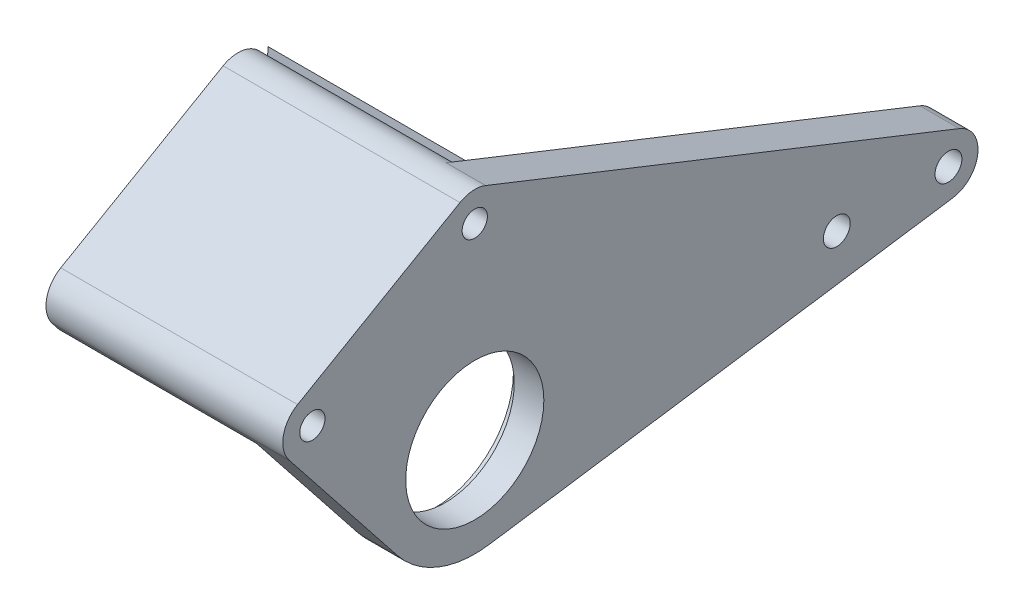
ISO-10303-21;
HEADER;
FILE_DESCRIPTION(('STEP AP214'),'2;1');
FILE_NAME('part.step','',(''),(''),'','','');
FILE_SCHEMA(('AUTOMOTIVE_DESIGN { 1 0 10303 214 1 1 1 1 }'));
ENDSEC;
DATA;
#1=APPLICATION_CONTEXT('core data for automotive mechanical design processes');
#2=APPLICATION_PROTOCOL_DEFINITION('international standard','automotive_design',2000,#1);
#3=PRODUCT_CONTEXT('',#1,'mechanical');
#4=PRODUCT('Part','Part','',(#3));
#5=PRODUCT_RELATED_PRODUCT_CATEGORY('part','',(#4));
#6=PRODUCT_DEFINITION_FORMATION('','',#4);
#7=PRODUCT_DEFINITION_CONTEXT('part definition',#1,'design');
#8=PRODUCT_DEFINITION('design','',#6,#7);
#9=PRODUCT_DEFINITION_SHAPE('','',#8);
#10=(LENGTH_UNIT() NAMED_UNIT(*) SI_UNIT(.MILLI.,.METRE.));
#11=(NAMED_UNIT(*) PLANE_ANGLE_UNIT() SI_UNIT($,.RADIAN.));
#12=(NAMED_UNIT(*) SI_UNIT($,.STERADIAN.) SOLID_ANGLE_UNIT());
#13=UNCERTAINTY_MEASURE_WITH_UNIT(LENGTH_MEASURE(1.E-05),#10,'distance_accuracy_value','');
#14=(GEOMETRIC_REPRESENTATION_CONTEXT(3) GLOBAL_UNCERTAINTY_ASSIGNED_CONTEXT((#13)) GLOBAL_UNIT_ASSIGNED_CONTEXT((#10,
#11,#12)) REPRESENTATION_CONTEXT('',''));
#15=CARTESIAN_POINT('',(0.,0.,0.));
#16=DIRECTION('',(0.,0.,1.));
#17=DIRECTION('',(1.,0.,0.));
#18=AXIS2_PLACEMENT_3D('',#15,#16,#17);
#19=CARTESIAN_POINT('',(6.35,0.,0.));
#20=DIRECTION('',(-1.,0.,0.));
#21=DIRECTION('',(0.,0.,-1.));
#22=AXIS2_PLACEMENT_3D('',#19,#20,#21);
#23=PLANE('',#22);
#24=CARTESIAN_POINT('',(6.35,30.1625,76.2));
#25=DIRECTION('',(1.,0.,0.));
#26=DIRECTION('',(0.,0.,-1.));
#27=AXIS2_PLACEMENT_3D('',#24,#25,#26);
#28=CIRCLE('',#27,2.03200000000001);
#29=CARTESIAN_POINT('',(6.35,30.1625,74.168));
#30=VERTEX_POINT('',#29);
#31=EDGE_CURVE('E387',#30,#30,#28,.T.);
#32=ORIENTED_EDGE('',*,*,#31,.T.);
#33=EDGE_LOOP('',(#32));
#34=FACE_BOUND('',#33,.T.);
#35=DIRECTION('',(0.,1.,0.));
#36=VECTOR('',#35,1.);
#37=CARTESIAN_POINT('',(6.35,28.2927511532294,72.9615));
#38=LINE('',#37,#36);
#39=CARTESIAN_POINT('',(6.35,28.2927511532294,72.9615));
#40=VERTEX_POINT('',#39);
#41=CARTESIAN_POINT('',(6.35,32.0322488467706,72.9615));
#42=VERTEX_POINT('',#41);
#43=EDGE_CURVE('E288',#40,#42,#38,.T.);
#44=ORIENTED_EDGE('',*,*,#43,.F.);
#45=DIRECTION('',(0.,0.5,-0.866025403784438));
#46=VECTOR('',#45,1.);
#47=CARTESIAN_POINT('',(6.35,26.4230023064588,76.2));
#48=LINE('',#47,#46);
#49=CARTESIAN_POINT('',(6.35,26.4230023064588,76.2));
#50=VERTEX_POINT('',#49);
#51=EDGE_CURVE('E312',#50,#40,#48,.T.);
#52=ORIENTED_EDGE('',*,*,#51,.F.);
#53=DIRECTION('',(0.,-0.5,-0.866025403784439));
#54=VECTOR('',#53,1.);
#55=CARTESIAN_POINT('',(6.35,28.2927511532294,79.4385));
#56=LINE('',#55,#54);
#57=CARTESIAN_POINT('',(6.35,28.2927511532294,79.4385));
#58=VERTEX_POINT('',#57);
#59=EDGE_CURVE('E309',#58,#50,#56,.T.);
#60=ORIENTED_EDGE('',*,*,#59,.F.);
#61=DIRECTION('',(0.,-1.,0.));
#62=VECTOR('',#61,1.);
#63=CARTESIAN_POINT('',(6.35,32.0322488467706,79.4385));
#64=LINE('',#63,#62);
#65=CARTESIAN_POINT('',(6.35,32.0322488467706,79.4385));
#66=VERTEX_POINT('',#65);
#67=EDGE_CURVE('E310',#66,#58,#64,.T.);
#68=ORIENTED_EDGE('',*,*,#67,.F.);
#69=DIRECTION('',(0.,-0.5,0.866025403784438));
#70=VECTOR('',#69,1.);
#71=CARTESIAN_POINT('',(6.35,33.9019976935412,76.2));
#72=LINE('',#71,#70);
#73=CARTESIAN_POINT('',(6.35,33.9019976935412,76.2));
#74=VERTEX_POINT('',#73);
#75=EDGE_CURVE('E302',#74,#66,#72,.T.);
#76=ORIENTED_EDGE('',*,*,#75,.F.);
#77=DIRECTION('',(0.,0.500000000000001,0.866025403784438));
#78=VECTOR('',#77,1.);
#79=CARTESIAN_POINT('',(6.35,32.0322488467706,72.9615));
#80=LINE('',#79,#78);
#81=EDGE_CURVE('E234',#42,#74,#80,.T.);
#82=ORIENTED_EDGE('',*,*,#81,.F.);
#83=EDGE_LOOP('',(#44,#52,#60,#68,#76,#82));
#84=FACE_BOUND('',#83,.T.);
#85=ADVANCED_FACE('F44',(#34,#84),#23,.T.);
#86=CARTESIAN_POINT('',(6.35,0.,76.2));
#87=DIRECTION('',(-1.,0.,0.));
#88=DIRECTION('',(0.,0.,1.));
#89=AXIS2_PLACEMENT_3D('',#86,#87,#88);
#90=CIRCLE('',#89,26.19375);
#91=CARTESIAN_POINT('',(6.35,11.4810411416951,99.7435391002543));
#92=VERTEX_POINT('',#91);
#93=CARTESIAN_POINT('',(6.35,26.1523276787176,74.7274864864865));
#94=VERTEX_POINT('',#93);
#95=EDGE_CURVE('E334',#92,#94,#90,.T.);
#96=ORIENTED_EDGE('',*,*,#95,.T.);
#97=CARTESIAN_POINT('',(6.35,29.3223067912894,74.549));
#98=DIRECTION('',(1.,0.,0.));
#99=DIRECTION('',(0.,0.,-1.));
#100=AXIS2_PLACEMENT_3D('',#97,#98,#99);
#101=CIRCLE('',#100,3.175);
#102=CARTESIAN_POINT('',(6.35,29.3223067912894,71.374));
#103=VERTEX_POINT('',#102);
#104=EDGE_CURVE('E52',#103,#94,#101,.F.);
#105=ORIENTED_EDGE('',*,*,#104,.F.);
#106=DIRECTION('',(0.,1.,0.));
#107=VECTOR('',#106,1.);
#108=CARTESIAN_POINT('',(6.35,25.7453347824902,71.374));
#109=LINE('',#108,#107);
#110=CARTESIAN_POINT('',(6.35,33.3742411658046,71.374));
#111=VERTEX_POINT('',#110);
#112=EDGE_CURVE('E329',#103,#111,#109,.T.);
#113=ORIENTED_EDGE('',*,*,#112,.T.);
#114=DIRECTION('',(0.,0.368048451007378,0.929806613071272));
#115=VECTOR('',#114,1.);
#116=CARTESIAN_POINT('',(6.35,4.42820399475193,-1.75283074792264));
#117=LINE('',#116,#115);
#118=CARTESIAN_POINT('',(6.35,4.42820399475193,-1.75283074792264));
#119=VERTEX_POINT('',#118);
#120=EDGE_CURVE('E406',#119,#111,#117,.T.);
#121=ORIENTED_EDGE('',*,*,#120,.F.);
#122=CARTESIAN_POINT('',(6.35,0.,0.));
#123=DIRECTION('',(1.,0.,0.));
#124=DIRECTION('',(0.,0.,-1.));
#125=AXIS2_PLACEMENT_3D('',#122,#123,#124);
#126=CIRCLE('',#125,4.7625);
#127=CARTESIAN_POINT('',(6.35,-4.71158493426293,-0.69453125));
#128=VERTEX_POINT('',#127);
#129=EDGE_CURVE('E401',#128,#119,#126,.T.);
#130=ORIENTED_EDGE('',*,*,#129,.F.);
#131=DIRECTION('',(0.,0.145833333333333,-0.989309172548647));
#132=VECTOR('',#131,1.);
#133=CARTESIAN_POINT('',(6.35,-15.7052831142098,73.8848958333333));
#134=LINE('',#133,#132);
#135=CARTESIAN_POINT('',(6.35,-15.7052831142098,73.8848958333333));
#136=VERTEX_POINT('',#135);
#137=EDGE_CURVE('E416',#136,#128,#134,.T.);
#138=ORIENTED_EDGE('',*,*,#137,.F.);
#139=CARTESIAN_POINT('',(6.35,0.,76.2));
#140=DIRECTION('',(1.,0.,0.));
#141=DIRECTION('',(0.,0.,-1.));
#142=AXIS2_PLACEMENT_3D('',#139,#140,#141);
#143=CIRCLE('',#142,15.875);
#144=CARTESIAN_POINT('',(6.35,-9.85675285972923,88.6442777236053));
#145=VERTEX_POINT('',#144);
#146=EDGE_CURVE('E412',#145,#136,#143,.T.);
#147=ORIENTED_EDGE('',*,*,#146,.F.);
#148=DIRECTION('',(0.,-0.783891510148367,-0.6208978179357));
#149=VECTOR('',#148,1.);
#150=CARTESIAN_POINT('',(6.35,12.1242241420813,106.05477455873));
#151=LINE('',#150,#149);
#152=CARTESIAN_POINT('',(6.35,10.9013319202577,105.086156960158));
#153=VERTEX_POINT('',#152);
#154=EDGE_CURVE('E411',#153,#145,#151,.T.);
#155=ORIENTED_EDGE('',*,*,#154,.F.);
#156=CARTESIAN_POINT('',(6.35,12.8726824922036,102.597301415437));
#157=DIRECTION('',(1.,0.,0.));
#158=DIRECTION('',(0.,0.,-1.));
#159=AXIS2_PLACEMENT_3D('',#156,#157,#158);
#160=CIRCLE('',#159,3.175);
#161=EDGE_CURVE('E11',#92,#153,#160,.F.);
#162=ORIENTED_EDGE('',*,*,#161,.F.);
#163=EDGE_LOOP('',(#96,#105,#113,#121,#130,#138,#147,#155,#162));
#164=FACE_BOUND('',#163,.T.);
#165=CARTESIAN_POINT('',(6.35,0.,76.2));
#166=DIRECTION('',(1.,0.,0.));
#167=DIRECTION('',(0.,0.,-1.));
#168=AXIS2_PLACEMENT_3D('',#165,#166,#167);
#169=CIRCLE('',#168,12.573);
#170=CARTESIAN_POINT('',(6.35,0.,63.627));
#171=VERTEX_POINT('',#170);
#172=EDGE_CURVE('E364',#171,#171,#169,.T.);
#173=ORIENTED_EDGE('',*,*,#172,.T.);
#174=EDGE_LOOP('',(#173));
#175=FACE_BOUND('',#174,.T.);
#176=CARTESIAN_POINT('',(6.35,0.,0.));
#177=DIRECTION('',(1.,0.,0.));
#178=DIRECTION('',(0.,0.,-1.));
#179=AXIS2_PLACEMENT_3D('',#176,#177,#178);
#180=CIRCLE('',#179,2.159);
#181=CARTESIAN_POINT('',(6.35,0.,-2.159));
#182=VERTEX_POINT('',#181);
#183=EDGE_CURVE('E392',#182,#182,#180,.T.);
#184=ORIENTED_EDGE('',*,*,#183,.T.);
#185=EDGE_LOOP('',(#184));
#186=FACE_BOUND('',#185,.T.);
#187=CARTESIAN_POINT('',(6.35,0.,17.9605122421383));
#188=DIRECTION('',(1.,0.,0.));
#189=DIRECTION('',(0.,0.,-1.));
#190=AXIS2_PLACEMENT_3D('',#187,#188,#189);
#191=CIRCLE('',#190,2.159);
#192=CARTESIAN_POINT('',(6.35,0.,15.8015122421383));
#193=VERTEX_POINT('',#192);
#194=EDGE_CURVE('E371',#193,#193,#191,.T.);
#195=ORIENTED_EDGE('',*,*,#194,.T.);
#196=EDGE_LOOP('',(#195));
#197=FACE_BOUND('',#196,.T.);
#198=ADVANCED_FACE('F488',(#164,#175,#186,#197),#23,.T.);
#199=CARTESIAN_POINT('',(6.35,15.0812500000001,102.321491241648));
#200=DIRECTION('',(1.,0.,0.));
#201=DIRECTION('',(0.,0.,-1.));
#202=AXIS2_PLACEMENT_3D('',#199,#200,#201);
#203=CIRCLE('',#202,2.03200000000002);
#204=CARTESIAN_POINT('',(6.35,15.0812500000001,100.289491241648));
#205=VERTEX_POINT('',#204);
#206=EDGE_CURVE('E379',#205,#205,#203,.T.);
#207=ORIENTED_EDGE('',*,*,#206,.T.);
#208=EDGE_LOOP('',(#207));
#209=FACE_BOUND('',#208,.T.);
#210=DIRECTION('',(0.,1.,0.));
#211=VECTOR('',#210,1.);
#212=CARTESIAN_POINT('',(6.35,13.2115011532295,99.0829912416481));
#213=LINE('',#212,#211);
#214=CARTESIAN_POINT('',(6.35,13.2115011532295,99.0829912416481));
#215=VERTEX_POINT('',#214);
#216=CARTESIAN_POINT('',(6.35,16.9509988467707,99.0829912416481));
#217=VERTEX_POINT('',#216);
#218=EDGE_CURVE('E244',#215,#217,#213,.T.);
#219=ORIENTED_EDGE('',*,*,#218,.F.);
#220=DIRECTION('',(0.,0.500000000000001,-0.866025403784438));
#221=VECTOR('',#220,1.);
#222=CARTESIAN_POINT('',(6.35,11.3417523064589,102.321491241648));
#223=LINE('',#222,#221);
#224=CARTESIAN_POINT('',(6.35,11.3417523064589,102.321491241648));
#225=VERTEX_POINT('',#224);
#226=EDGE_CURVE('E269',#225,#215,#223,.T.);
#227=ORIENTED_EDGE('',*,*,#226,.F.);
#228=DIRECTION('',(0.,-0.5,-0.866025403784439));
#229=VECTOR('',#228,1.);
#230=CARTESIAN_POINT('',(6.35,13.2115011532295,105.559991241648));
#231=LINE('',#230,#229);
#232=CARTESIAN_POINT('',(6.35,13.2115011532295,105.559991241648));
#233=VERTEX_POINT('',#232);
#234=EDGE_CURVE('E268',#233,#225,#231,.T.);
#235=ORIENTED_EDGE('',*,*,#234,.F.);
#236=DIRECTION('',(0.,-1.,0.));
#237=VECTOR('',#236,1.);
#238=CARTESIAN_POINT('',(6.35,16.9509988467707,105.559991241648));
#239=LINE('',#238,#237);
#240=CARTESIAN_POINT('',(6.35,16.9509988467707,105.559991241648));
#241=VERTEX_POINT('',#240);
#242=EDGE_CURVE('E261',#241,#233,#239,.T.);
#243=ORIENTED_EDGE('',*,*,#242,.F.);
#244=DIRECTION('',(0.,-0.500000000000001,0.866025403784438));
#245=VECTOR('',#244,1.);
#246=CARTESIAN_POINT('',(6.35,18.8207476935413,102.321491241648));
#247=LINE('',#246,#245);
#248=CARTESIAN_POINT('',(6.35,18.8207476935413,102.321491241648));
#249=VERTEX_POINT('',#248);
#250=EDGE_CURVE('E263',#249,#241,#247,.T.);
#251=ORIENTED_EDGE('',*,*,#250,.F.);
#252=DIRECTION('',(0.,0.5,0.866025403784439));
#253=VECTOR('',#252,1.);
#254=CARTESIAN_POINT('',(6.35,16.9509988467707,99.0829912416481));
#255=LINE('',#254,#253);
#256=EDGE_CURVE('E230',#217,#249,#255,.T.);
#257=ORIENTED_EDGE('',*,*,#256,.F.);
#258=EDGE_LOOP('',(#219,#227,#235,#243,#251,#257));
#259=FACE_BOUND('',#258,.T.);
#260=ADVANCED_FACE('F540',(#209,#259),#23,.T.);
#261=CARTESIAN_POINT('',(6.35,0.,76.2));
#262=DIRECTION('',(1.,0.,0.));
#263=DIRECTION('',(0.,0.,1.));
#264=AXIS2_PLACEMENT_3D('',#261,#262,#263);
#265=CYLINDRICAL_SURFACE('',#264,11.1125);
#266=CARTESIAN_POINT('',(12.7,0.,76.2));
#267=DIRECTION('',(1.,0.,0.));
#268=DIRECTION('',(0.,0.,-1.));
#269=AXIS2_PLACEMENT_3D('',#266,#267,#268);
#270=CIRCLE('',#269,11.1125);
#271=CARTESIAN_POINT('',(12.7,0.,65.0875));
#272=VERTEX_POINT('',#271);
#273=EDGE_CURVE('E386',#272,#272,#270,.T.);
#274=ORIENTED_EDGE('',*,*,#273,.T.);
#275=EDGE_LOOP('',(#274));
#276=FACE_BOUND('',#275,.T.);
#277=CARTESIAN_POINT('',(7.9375,0.,76.2));
#278=DIRECTION('',(1.,0.,0.));
#279=DIRECTION('',(0.,0.,-1.));
#280=AXIS2_PLACEMENT_3D('',#277,#278,#279);
#281=CIRCLE('',#280,11.1125);
#282=CARTESIAN_POINT('',(7.9375,0.,65.0875));
#283=VERTEX_POINT('',#282);
#284=EDGE_CURVE('E368',#283,#283,#281,.T.);
#285=ORIENTED_EDGE('',*,*,#284,.F.);
#286=EDGE_LOOP('',(#285));
#287=FACE_BOUND('',#286,.T.);
#288=ADVANCED_FACE('F541',(#276,#287),#265,.F.);
#289=CARTESIAN_POINT('',(6.35,30.1625,76.2));
#290=DIRECTION('',(1.,0.,0.));
#291=DIRECTION('',(0.,0.,-1.));
#292=AXIS2_PLACEMENT_3D('',#289,#290,#291);
#293=CIRCLE('',#292,4.7625);
#294=CARTESIAN_POINT('',(6.35,30.6634050626262,71.4639150801284));
#295=VERTEX_POINT('',#294);
#296=CARTESIAN_POINT('',(6.35,34.5907039947519,74.4471692520774));
#297=VERTEX_POINT('',#296);
#298=EDGE_CURVE('E358',#295,#297,#293,.T.);
#299=ORIENTED_EDGE('',*,*,#298,.T.);
#300=EDGE_CURVE('E410',#111,#297,#117,.T.);
#301=ORIENTED_EDGE('',*,*,#300,.F.);
#302=DIRECTION('',(0.,-0.999450370053792,0.0331505324141011));
#303=VECTOR('',#302,1.);
#304=CARTESIAN_POINT('',(6.35,30.6634050626262,71.4639150801284));
#305=LINE('',#304,#303);
#306=EDGE_CURVE('E351',#111,#295,#305,.T.);
#307=ORIENTED_EDGE('',*,*,#306,.T.);
#308=EDGE_LOOP('',(#299,#301,#307));
#309=FACE_BOUND('',#308,.T.);
#310=ADVANCED_FACE('F535',(#309),#23,.T.);
#311=CARTESIAN_POINT('',(12.7,0.,0.));
#312=DIRECTION('',(-1.,0.,0.));
#313=DIRECTION('',(0.,0.,-1.));
#314=AXIS2_PLACEMENT_3D('',#311,#312,#313);
#315=PLANE('',#314);
#316=CARTESIAN_POINT('',(12.7,0.,0.));
#317=DIRECTION('',(1.,0.,0.));
#318=DIRECTION('',(0.,0.,-1.));
#319=AXIS2_PLACEMENT_3D('',#316,#317,#318);
#320=CIRCLE('',#319,4.7625);
#321=CARTESIAN_POINT('',(12.7,-4.71158493426293,-0.69453125));
#322=VERTEX_POINT('',#321);
#323=CARTESIAN_POINT('',(12.7,4.42820399475193,-1.75283074792264));
#324=VERTEX_POINT('',#323);
#325=EDGE_CURVE('E399',#322,#324,#320,.T.);
#326=ORIENTED_EDGE('',*,*,#325,.T.);
#327=DIRECTION('',(0.,0.368048451007378,0.929806613071272));
#328=VECTOR('',#327,1.);
#329=CARTESIAN_POINT('',(12.7,4.42820399475193,-1.75283074792264));
#330=LINE('',#329,#328);
#331=CARTESIAN_POINT('',(12.7,34.5907039947519,74.4471692520774));
#332=VERTEX_POINT('',#331);
#333=EDGE_CURVE('E428',#324,#332,#330,.T.);
#334=ORIENTED_EDGE('',*,*,#333,.T.);
#335=CARTESIAN_POINT('',(12.7,30.1625,76.2));
#336=DIRECTION('',(1.,0.,0.));
#337=DIRECTION('',(0.,0.,-1.));
#338=AXIS2_PLACEMENT_3D('',#335,#336,#337);
#339=CIRCLE('',#338,4.7625);
#340=CARTESIAN_POINT('',(12.7,34.2869459855234,78.58125));
#341=VERTEX_POINT('',#340);
#342=EDGE_CURVE('E427',#332,#341,#339,.T.);
#343=ORIENTED_EDGE('',*,*,#342,.T.);
#344=DIRECTION('',(0.,-0.499999999999998,0.86602540378444));
#345=VECTOR('',#344,1.);
#346=CARTESIAN_POINT('',(12.7,34.2869459855234,78.58125));
#347=LINE('',#346,#345);
#348=CARTESIAN_POINT('',(12.7,19.2056959855235,104.702741241648));
#349=VERTEX_POINT('',#348);
#350=EDGE_CURVE('E433',#341,#349,#347,.T.);
#351=ORIENTED_EDGE('',*,*,#350,.T.);
#352=CARTESIAN_POINT('',(12.7,15.0812500000001,102.321491241648));
#353=DIRECTION('',(1.,0.,0.));
#354=DIRECTION('',(0.,0.,-1.));
#355=AXIS2_PLACEMENT_3D('',#352,#353,#354);
#356=CIRCLE('',#355,4.7625);
#357=CARTESIAN_POINT('',(12.7,12.1242241420814,106.05477455873));
#358=VERTEX_POINT('',#357);
#359=EDGE_CURVE('E436',#349,#358,#356,.T.);
#360=ORIENTED_EDGE('',*,*,#359,.T.);
#361=DIRECTION('',(0.,-0.783891510148367,-0.6208978179357));
#362=VECTOR('',#361,1.);
#363=CARTESIAN_POINT('',(12.7,12.1242241420813,106.05477455873));
#364=LINE('',#363,#362);
#365=CARTESIAN_POINT('',(12.7,-9.85675285972923,88.6442777236053));
#366=VERTEX_POINT('',#365);
#367=EDGE_CURVE('E437',#358,#366,#364,.T.);
#368=ORIENTED_EDGE('',*,*,#367,.T.);
#369=CARTESIAN_POINT('',(12.7,0.,76.2));
#370=DIRECTION('',(1.,0.,0.));
#371=DIRECTION('',(0.,0.,-1.));
#372=AXIS2_PLACEMENT_3D('',#369,#370,#371);
#373=CIRCLE('',#372,15.875);
#374=CARTESIAN_POINT('',(12.7,-15.7052831142098,73.8848958333333));
#375=VERTEX_POINT('',#374);
#376=EDGE_CURVE('E445',#366,#375,#373,.T.);
#377=ORIENTED_EDGE('',*,*,#376,.T.);
#378=DIRECTION('',(0.,0.145833333333333,-0.989309172548647));
#379=VECTOR('',#378,1.);
#380=CARTESIAN_POINT('',(12.7,-15.7052831142098,73.8848958333333));
#381=LINE('',#380,#379);
#382=EDGE_CURVE('E409',#375,#322,#381,.T.);
#383=ORIENTED_EDGE('',*,*,#382,.T.);
#384=EDGE_LOOP('',(#326,#334,#343,#351,#360,#368,#377,#383));
#385=FACE_BOUND('',#384,.T.);
#386=CARTESIAN_POINT('',(12.7,0.,0.));
#387=DIRECTION('',(1.,0.,0.));
#388=DIRECTION('',(0.,0.,-1.));
#389=AXIS2_PLACEMENT_3D('',#386,#387,#388);
#390=CIRCLE('',#389,2.159);
#391=CARTESIAN_POINT('',(12.7,0.,-2.159));
#392=VERTEX_POINT('',#391);
#393=EDGE_CURVE('E394',#392,#392,#390,.T.);
#394=ORIENTED_EDGE('',*,*,#393,.F.);
#395=EDGE_LOOP('',(#394));
#396=FACE_BOUND('',#395,.T.);
#397=ORIENTED_EDGE('',*,*,#273,.F.);
#398=EDGE_LOOP('',(#397));
#399=FACE_BOUND('',#398,.T.);
#400=CARTESIAN_POINT('',(12.7,30.1625,76.2));
#401=DIRECTION('',(1.,0.,0.));
#402=DIRECTION('',(0.,0.,-1.));
#403=AXIS2_PLACEMENT_3D('',#400,#401,#402);
#404=CIRCLE('',#403,2.03200000000001);
#405=CARTESIAN_POINT('',(12.7,30.1625,74.168));
#406=VERTEX_POINT('',#405);
#407=EDGE_CURVE('E384',#406,#406,#404,.T.);
#408=ORIENTED_EDGE('',*,*,#407,.F.);
#409=EDGE_LOOP('',(#408));
#410=FACE_BOUND('',#409,.T.);
#411=CARTESIAN_POINT('',(12.7,15.0812500000001,102.321491241648));
#412=DIRECTION('',(1.,0.,0.));
#413=DIRECTION('',(0.,0.,-1.));
#414=AXIS2_PLACEMENT_3D('',#411,#412,#413);
#415=CIRCLE('',#414,2.03200000000002);
#416=CARTESIAN_POINT('',(12.7,15.0812500000001,100.289491241648));
#417=VERTEX_POINT('',#416);
#418=EDGE_CURVE('E374',#417,#417,#415,.T.);
#419=ORIENTED_EDGE('',*,*,#418,.F.);
#420=EDGE_LOOP('',(#419));
#421=FACE_BOUND('',#420,.T.);
#422=CARTESIAN_POINT('',(12.7,0.,17.9605122421383));
#423=DIRECTION('',(1.,0.,0.));
#424=DIRECTION('',(0.,0.,-1.));
#425=AXIS2_PLACEMENT_3D('',#422,#423,#424);
#426=CIRCLE('',#425,2.159);
#427=CARTESIAN_POINT('',(12.7,0.,15.8015122421383));
#428=VERTEX_POINT('',#427);
#429=EDGE_CURVE('E376',#428,#428,#426,.T.);
#430=ORIENTED_EDGE('',*,*,#429,.F.);
#431=EDGE_LOOP('',(#430));
#432=FACE_BOUND('',#431,.T.);
#433=ADVANCED_FACE('F545',(#385,#396,#399,#410,#421,#432),#315,.F.);
#434=CARTESIAN_POINT('',(6.35,0.,0.));
#435=DIRECTION('',(1.,0.,0.));
#436=DIRECTION('',(0.,0.,1.));
#437=AXIS2_PLACEMENT_3D('',#434,#435,#436);
#438=CYLINDRICAL_SURFACE('',#437,4.7625);
#439=ORIENTED_EDGE('',*,*,#325,.F.);
#440=DIRECTION('',(1.,0.,0.));
#441=VECTOR('',#440,1.);
#442=CARTESIAN_POINT('',(6.35,-4.71158493426293,-0.69453125));
#443=LINE('',#442,#441);
#444=EDGE_CURVE('E422',#128,#322,#443,.T.);
#445=ORIENTED_EDGE('',*,*,#444,.F.);
#446=ORIENTED_EDGE('',*,*,#129,.T.);
#447=DIRECTION('',(1.,0.,0.));
#448=VECTOR('',#447,1.);
#449=CARTESIAN_POINT('',(6.35,4.42820399475193,-1.75283074792264));
#450=LINE('',#449,#448);
#451=EDGE_CURVE('E465',#119,#324,#450,.T.);
#452=ORIENTED_EDGE('',*,*,#451,.T.);
#453=EDGE_LOOP('',(#439,#445,#446,#452));
#454=FACE_BOUND('',#453,.T.);
#455=ADVANCED_FACE('F507',(#454),#438,.T.);
#456=CARTESIAN_POINT('',(6.35,4.42820399475193,-1.75283074792264));
#457=DIRECTION('',(0.,-0.929806613071272,0.368048451007378));
#458=DIRECTION('',(0.,-0.368048451007378,-0.929806613071272));
#459=AXIS2_PLACEMENT_3D('',#456,#457,#458);
#460=PLANE('',#459);
#461=ORIENTED_EDGE('',*,*,#333,.F.);
#462=ORIENTED_EDGE('',*,*,#451,.F.);
#463=ORIENTED_EDGE('',*,*,#120,.T.);
#464=ORIENTED_EDGE('',*,*,#300,.T.);
#465=DIRECTION('',(1.,0.,0.));
#466=VECTOR('',#465,1.);
#467=CARTESIAN_POINT('',(6.35,34.5907039947519,74.4471692520774));
#468=LINE('',#467,#466);
#469=EDGE_CURVE('E457',#297,#332,#468,.T.);
#470=ORIENTED_EDGE('',*,*,#469,.T.);
#471=EDGE_LOOP('',(#461,#462,#463,#464,#470));
#472=FACE_BOUND('',#471,.T.);
#473=ADVANCED_FACE('F502',(#472),#460,.F.);
#474=CARTESIAN_POINT('',(6.35,30.1625,76.2));
#475=DIRECTION('',(1.,0.,0.));
#476=DIRECTION('',(0.,0.,1.));
#477=AXIS2_PLACEMENT_3D('',#474,#475,#476);
#478=CYLINDRICAL_SURFACE('',#477,4.7625);
#479=ORIENTED_EDGE('',*,*,#342,.F.);
#480=ORIENTED_EDGE('',*,*,#469,.F.);
#481=ORIENTED_EDGE('',*,*,#298,.F.);
#482=DIRECTION('',(1.,0.,0.));
#483=VECTOR('',#482,1.);
#484=CARTESIAN_POINT('',(-25.4,30.6634050626262,71.4639150801284));
#485=LINE('',#484,#483);
#486=CARTESIAN_POINT('',(-25.4,30.6634050626262,71.4639150801284));
#487=VERTEX_POINT('',#486);
#488=EDGE_CURVE('E347',#487,#295,#485,.T.);
#489=ORIENTED_EDGE('',*,*,#488,.F.);
#490=CARTESIAN_POINT('',(-25.4,30.1625,76.2));
#491=DIRECTION('',(1.,0.,0.));
#492=DIRECTION('',(0.,0.,-1.));
#493=AXIS2_PLACEMENT_3D('',#490,#491,#492);
#494=CIRCLE('',#493,4.7625);
#495=CARTESIAN_POINT('',(-25.4,34.2869459855234,78.58125));
#496=VERTEX_POINT('',#495);
#497=EDGE_CURVE('E337',#487,#496,#494,.T.);
#498=ORIENTED_EDGE('',*,*,#497,.T.);
#499=DIRECTION('',(1.,0.,0.));
#500=VECTOR('',#499,1.);
#501=CARTESIAN_POINT('',(6.35,34.2869459855234,78.58125));
#502=LINE('',#501,#500);
#503=EDGE_CURVE('E456',#496,#341,#502,.T.);
#504=ORIENTED_EDGE('',*,*,#503,.T.);
#505=EDGE_LOOP('',(#479,#480,#481,#489,#498,#504));
#506=FACE_BOUND('',#505,.T.);
#507=ADVANCED_FACE('F688',(#506),#478,.T.);
#508=CARTESIAN_POINT('',(6.35,34.2869459855234,78.58125));
#509=DIRECTION('',(0.,-0.86602540378444,-0.499999999999998));
#510=DIRECTION('',(0.,0.499999999999998,-0.86602540378444));
#511=AXIS2_PLACEMENT_3D('',#508,#509,#510);
#512=PLANE('',#511);
#513=ORIENTED_EDGE('',*,*,#350,.F.);
#514=ORIENTED_EDGE('',*,*,#503,.F.);
#515=DIRECTION('',(0.,-0.5,0.866025403784439));
#516=VECTOR('',#515,1.);
#517=CARTESIAN_POINT('',(-25.4,34.2869459855234,78.58125));
#518=LINE('',#517,#516);
#519=CARTESIAN_POINT('',(-25.4,19.2056959855234,104.702741241648));
#520=VERTEX_POINT('',#519);
#521=EDGE_CURVE('E339',#496,#520,#518,.T.);
#522=ORIENTED_EDGE('',*,*,#521,.T.);
#523=DIRECTION('',(1.,0.,0.));
#524=VECTOR('',#523,1.);
#525=CARTESIAN_POINT('',(6.35,19.2056959855235,104.702741241648));
#526=LINE('',#525,#524);
#527=EDGE_CURVE('E458',#520,#349,#526,.T.);
#528=ORIENTED_EDGE('',*,*,#527,.T.);
#529=EDGE_LOOP('',(#513,#514,#522,#528));
#530=FACE_BOUND('',#529,.T.);
#531=ADVANCED_FACE('F528',(#530),#512,.F.);
#532=CARTESIAN_POINT('',(6.35,15.0812500000001,102.321491241648));
#533=DIRECTION('',(1.,0.,0.));
#534=DIRECTION('',(0.,0.,1.));
#535=AXIS2_PLACEMENT_3D('',#532,#533,#534);
#536=CYLINDRICAL_SURFACE('',#535,4.7625);
#537=ORIENTED_EDGE('',*,*,#359,.F.);
#538=ORIENTED_EDGE('',*,*,#527,.F.);
#539=CARTESIAN_POINT('',(-25.4,15.0812500000001,102.321491241648));
#540=DIRECTION('',(1.,0.,0.));
#541=DIRECTION('',(0.,0.,-1.));
#542=AXIS2_PLACEMENT_3D('',#539,#540,#541);
#543=CIRCLE('',#542,4.76249999999997);
#544=CARTESIAN_POINT('',(-25.4,12.1242241420814,106.05477455873));
#545=VERTEX_POINT('',#544);
#546=EDGE_CURVE('E345',#520,#545,#543,.T.);
#547=ORIENTED_EDGE('',*,*,#546,.T.);
#548=DIRECTION('',(1.,0.,0.));
#549=VECTOR('',#548,1.);
#550=CARTESIAN_POINT('',(6.35,12.1242241420814,106.05477455873));
#551=LINE('',#550,#549);
#552=EDGE_CURVE('E451',#545,#358,#551,.T.);
#553=ORIENTED_EDGE('',*,*,#552,.T.);
#554=EDGE_LOOP('',(#537,#538,#547,#553));
#555=FACE_BOUND('',#554,.T.);
#556=ADVANCED_FACE('F516',(#555),#536,.T.);
#557=CARTESIAN_POINT('',(6.35,12.1242241420813,106.05477455873));
#558=DIRECTION('',(0.,0.6208978179357,-0.783891510148367));
#559=DIRECTION('',(0.,0.783891510148367,0.6208978179357));
#560=AXIS2_PLACEMENT_3D('',#557,#558,#559);
#561=PLANE('',#560);
#562=ORIENTED_EDGE('',*,*,#154,.T.);
#563=DIRECTION('',(1.,0.,0.));
#564=VECTOR('',#563,1.);
#565=CARTESIAN_POINT('',(6.35,-9.85675285972923,88.6442777236053));
#566=LINE('',#565,#564);
#567=EDGE_CURVE('E455',#145,#366,#566,.T.);
#568=ORIENTED_EDGE('',*,*,#567,.T.);
#569=ORIENTED_EDGE('',*,*,#367,.F.);
#570=ORIENTED_EDGE('',*,*,#552,.F.);
#571=DIRECTION('',(0.,-0.783891510148367,-0.620897817935699));
#572=VECTOR('',#571,1.);
#573=CARTESIAN_POINT('',(-25.4,12.1242241420813,106.05477455873));
#574=LINE('',#573,#572);
#575=CARTESIAN_POINT('',(-25.4,10.9013319202577,105.086156960158));
#576=VERTEX_POINT('',#575);
#577=EDGE_CURVE('E343',#545,#576,#574,.T.);
#578=ORIENTED_EDGE('',*,*,#577,.T.);
#579=DIRECTION('',(1.,0.,0.));
#580=VECTOR('',#579,1.);
#581=CARTESIAN_POINT('',(6.35,10.9013319202577,105.086156960158));
#582=LINE('',#581,#580);
#583=EDGE_CURVE('E58',#153,#576,#582,.F.);
#584=ORIENTED_EDGE('',*,*,#583,.F.);
#585=EDGE_LOOP('',(#562,#568,#569,#570,#578,#584));
#586=FACE_BOUND('',#585,.T.);
#587=ADVANCED_FACE('F520',(#586),#561,.F.);
#588=CARTESIAN_POINT('',(6.35,0.,76.2));
#589=DIRECTION('',(1.,0.,0.));
#590=DIRECTION('',(0.,0.,1.));
#591=AXIS2_PLACEMENT_3D('',#588,#589,#590);
#592=CYLINDRICAL_SURFACE('',#591,15.875);
#593=ORIENTED_EDGE('',*,*,#376,.F.);
#594=ORIENTED_EDGE('',*,*,#567,.F.);
#595=ORIENTED_EDGE('',*,*,#146,.T.);
#596=DIRECTION('',(1.,0.,0.));
#597=VECTOR('',#596,1.);
#598=CARTESIAN_POINT('',(6.35,-15.7052831142098,73.8848958333333));
#599=LINE('',#598,#597);
#600=EDGE_CURVE('E448',#136,#375,#599,.T.);
#601=ORIENTED_EDGE('',*,*,#600,.T.);
#602=EDGE_LOOP('',(#593,#594,#595,#601));
#603=FACE_BOUND('',#602,.T.);
#604=ADVANCED_FACE('F513',(#603),#592,.T.);
#605=CARTESIAN_POINT('',(6.35,-15.7052831142098,73.8848958333333));
#606=DIRECTION('',(0.,0.989309172548647,0.145833333333333));
#607=DIRECTION('',(0.,-0.145833333333333,0.989309172548647));
#608=AXIS2_PLACEMENT_3D('',#605,#606,#607);
#609=PLANE('',#608);
#610=ORIENTED_EDGE('',*,*,#382,.F.);
#611=ORIENTED_EDGE('',*,*,#600,.F.);
#612=ORIENTED_EDGE('',*,*,#137,.T.);
#613=ORIENTED_EDGE('',*,*,#444,.T.);
#614=EDGE_LOOP('',(#610,#611,#612,#613));
#615=FACE_BOUND('',#614,.T.);
#616=ADVANCED_FACE('F512',(#615),#609,.F.);
#617=CARTESIAN_POINT('',(6.35,0.,0.));
#618=DIRECTION('',(1.,0.,0.));
#619=DIRECTION('',(0.,0.,1.));
#620=AXIS2_PLACEMENT_3D('',#617,#618,#619);
#621=CYLINDRICAL_SURFACE('',#620,2.159);
#622=ORIENTED_EDGE('',*,*,#183,.F.);
#623=EDGE_LOOP('',(#622));
#624=FACE_BOUND('',#623,.T.);
#625=ORIENTED_EDGE('',*,*,#393,.T.);
#626=EDGE_LOOP('',(#625));
#627=FACE_BOUND('',#626,.T.);
#628=ADVANCED_FACE('F640',(#624,#627),#621,.F.);
#629=CARTESIAN_POINT('',(6.35,30.1625,76.2));
#630=DIRECTION('',(1.,0.,0.));
#631=DIRECTION('',(0.,0.,1.));
#632=AXIS2_PLACEMENT_3D('',#629,#630,#631);
#633=CYLINDRICAL_SURFACE('',#632,2.03200000000001);
#634=ORIENTED_EDGE('',*,*,#31,.F.);
#635=EDGE_LOOP('',(#634));
#636=FACE_BOUND('',#635,.T.);
#637=ORIENTED_EDGE('',*,*,#407,.T.);
#638=EDGE_LOOP('',(#637));
#639=FACE_BOUND('',#638,.T.);
#640=ADVANCED_FACE('F632',(#636,#639),#633,.F.);
#641=CARTESIAN_POINT('',(6.35,15.0812500000001,102.321491241648));
#642=DIRECTION('',(1.,0.,0.));
#643=DIRECTION('',(0.,0.,1.));
#644=AXIS2_PLACEMENT_3D('',#641,#642,#643);
#645=CYLINDRICAL_SURFACE('',#644,2.03200000000002);
#646=ORIENTED_EDGE('',*,*,#206,.F.);
#647=EDGE_LOOP('',(#646));
#648=FACE_BOUND('',#647,.T.);
#649=ORIENTED_EDGE('',*,*,#418,.T.);
#650=EDGE_LOOP('',(#649));
#651=FACE_BOUND('',#650,.T.);
#652=ADVANCED_FACE('F629',(#648,#651),#645,.F.);
#653=CARTESIAN_POINT('',(6.35,0.,17.9605122421383));
#654=DIRECTION('',(1.,0.,0.));
#655=DIRECTION('',(0.,0.,1.));
#656=AXIS2_PLACEMENT_3D('',#653,#654,#655);
#657=CYLINDRICAL_SURFACE('',#656,2.159);
#658=ORIENTED_EDGE('',*,*,#194,.F.);
#659=EDGE_LOOP('',(#658));
#660=FACE_BOUND('',#659,.T.);
#661=ORIENTED_EDGE('',*,*,#429,.T.);
#662=EDGE_LOOP('',(#661));
#663=FACE_BOUND('',#662,.T.);
#664=ADVANCED_FACE('F626',(#660,#663),#657,.F.);
#665=CARTESIAN_POINT('',(7.9375,0.,76.2));
#666=DIRECTION('',(-1.,0.,0.));
#667=DIRECTION('',(0.,0.,-1.));
#668=AXIS2_PLACEMENT_3D('',#665,#666,#667);
#669=CYLINDRICAL_SURFACE('',#668,12.573);
#670=CARTESIAN_POINT('',(7.9375,0.,76.2));
#671=DIRECTION('',(1.,0.,0.));
#672=DIRECTION('',(0.,0.,-1.));
#673=AXIS2_PLACEMENT_3D('',#670,#671,#672);
#674=CIRCLE('',#673,12.573);
#675=CARTESIAN_POINT('',(7.9375,0.,63.627));
#676=VERTEX_POINT('',#675);
#677=EDGE_CURVE('E362',#676,#676,#674,.T.);
#678=ORIENTED_EDGE('',*,*,#677,.T.);
#679=EDGE_LOOP('',(#678));
#680=FACE_BOUND('',#679,.T.);
#681=ORIENTED_EDGE('',*,*,#172,.F.);
#682=EDGE_LOOP('',(#681));
#683=FACE_BOUND('',#682,.T.);
#684=ADVANCED_FACE('F625',(#680,#683),#669,.F.);
#685=CARTESIAN_POINT('',(7.9375,0.,76.2));
#686=DIRECTION('',(-1.,0.,0.));
#687=DIRECTION('',(0.,0.,-1.));
#688=AXIS2_PLACEMENT_3D('',#685,#686,#687);
#689=PLANE('',#688);
#690=ORIENTED_EDGE('',*,*,#284,.T.);
#691=EDGE_LOOP('',(#690));
#692=FACE_BOUND('',#691,.T.);
#693=ORIENTED_EDGE('',*,*,#677,.F.);
#694=EDGE_LOOP('',(#693));
#695=FACE_BOUND('',#694,.T.);
#696=ADVANCED_FACE('F613',(#692,#695),#689,.T.);
#697=CARTESIAN_POINT('',(-25.4,30.1625,76.2));
#698=DIRECTION('',(-1.,0.,0.));
#699=DIRECTION('',(0.,0.,-1.));
#700=AXIS2_PLACEMENT_3D('',#697,#698,#699);
#701=PLANE('',#700);
#702=CARTESIAN_POINT('',(-25.4,0.,76.2));
#703=DIRECTION('',(-1.,0.,0.));
#704=DIRECTION('',(0.,0.,1.));
#705=AXIS2_PLACEMENT_3D('',#702,#703,#704);
#706=CIRCLE('',#705,26.19375);
#707=CARTESIAN_POINT('',(-25.4,11.4810411416951,99.7435391002543));
#708=VERTEX_POINT('',#707);
#709=CARTESIAN_POINT('',(-25.4,26.1523276787176,74.7274864864865));
#710=VERTEX_POINT('',#709);
#711=EDGE_CURVE('E350',#708,#710,#706,.T.);
#712=ORIENTED_EDGE('',*,*,#711,.F.);
#713=CARTESIAN_POINT('',(-25.4,12.8726824922036,102.597301415437));
#714=DIRECTION('',(1.,0.,0.));
#715=DIRECTION('',(0.,0.,-1.));
#716=AXIS2_PLACEMENT_3D('',#713,#714,#715);
#717=CIRCLE('',#716,3.175);
#718=EDGE_CURVE('E70',#576,#708,#717,.T.);
#719=ORIENTED_EDGE('',*,*,#718,.F.);
#720=ORIENTED_EDGE('',*,*,#577,.F.);
#721=ORIENTED_EDGE('',*,*,#546,.F.);
#722=ORIENTED_EDGE('',*,*,#521,.F.);
#723=ORIENTED_EDGE('',*,*,#497,.F.);
#724=DIRECTION('',(0.,-0.999450370053792,0.0331505324141011));
#725=VECTOR('',#724,1.);
#726=CARTESIAN_POINT('',(-25.4,30.6634050626262,71.4639150801284));
#727=LINE('',#726,#725);
#728=CARTESIAN_POINT('',(-25.4,33.3742411658046,71.374));
#729=VERTEX_POINT('',#728);
#730=EDGE_CURVE('E331',#729,#487,#727,.T.);
#731=ORIENTED_EDGE('',*,*,#730,.F.);
#732=DIRECTION('',(0.,1.,0.));
#733=VECTOR('',#732,1.);
#734=CARTESIAN_POINT('',(-25.4,25.7453347824902,71.374));
#735=LINE('',#734,#733);
#736=CARTESIAN_POINT('',(-25.4,29.3223067912894,71.374));
#737=VERTEX_POINT('',#736);
#738=EDGE_CURVE('E327',#737,#729,#735,.T.);
#739=ORIENTED_EDGE('',*,*,#738,.F.);
#740=CARTESIAN_POINT('',(-25.4,29.3223067912894,74.549));
#741=DIRECTION('',(1.,0.,0.));
#742=DIRECTION('',(0.,0.,-1.));
#743=AXIS2_PLACEMENT_3D('',#740,#741,#742);
#744=CIRCLE('',#743,3.175);
#745=EDGE_CURVE('E471',#710,#737,#744,.T.);
#746=ORIENTED_EDGE('',*,*,#745,.F.);
#747=EDGE_LOOP('',(#712,#719,#720,#721,#722,#723,#731,#739,#746));
#748=FACE_BOUND('',#747,.T.);
#749=DIRECTION('',(0.,-0.5,0.866025403784438));
#750=VECTOR('',#749,1.);
#751=CARTESIAN_POINT('',(-25.4,33.9019976935412,76.2));
#752=LINE('',#751,#750);
#753=CARTESIAN_POINT('',(-25.4,33.9019976935412,76.2));
#754=VERTEX_POINT('',#753);
#755=CARTESIAN_POINT('',(-25.4,32.0322488467706,79.4385));
#756=VERTEX_POINT('',#755);
#757=EDGE_CURVE('E282',#754,#756,#752,.T.);
#758=ORIENTED_EDGE('',*,*,#757,.T.);
#759=DIRECTION('',(0.,-1.,0.));
#760=VECTOR('',#759,1.);
#761=CARTESIAN_POINT('',(-25.4,32.0322488467706,79.4385));
#762=LINE('',#761,#760);
#763=CARTESIAN_POINT('',(-25.4,28.2927511532294,79.4385));
#764=VERTEX_POINT('',#763);
#765=EDGE_CURVE('E289',#756,#764,#762,.T.);
#766=ORIENTED_EDGE('',*,*,#765,.T.);
#767=DIRECTION('',(0.,-0.5,-0.866025403784439));
#768=VECTOR('',#767,1.);
#769=CARTESIAN_POINT('',(-25.4,28.2927511532294,79.4385));
#770=LINE('',#769,#768);
#771=CARTESIAN_POINT('',(-25.4,26.4230023064588,76.2));
#772=VERTEX_POINT('',#771);
#773=EDGE_CURVE('E292',#764,#772,#770,.T.);
#774=ORIENTED_EDGE('',*,*,#773,.T.);
#775=DIRECTION('',(0.,0.5,-0.866025403784438));
#776=VECTOR('',#775,1.);
#777=CARTESIAN_POINT('',(-25.4,26.4230023064588,76.2));
#778=LINE('',#777,#776);
#779=CARTESIAN_POINT('',(-25.4,28.2927511532294,72.9615));
#780=VERTEX_POINT('',#779);
#781=EDGE_CURVE('E294',#772,#780,#778,.T.);
#782=ORIENTED_EDGE('',*,*,#781,.T.);
#783=DIRECTION('',(0.,1.,0.));
#784=VECTOR('',#783,1.);
#785=CARTESIAN_POINT('',(-25.4,28.2927511532294,72.9615));
#786=LINE('',#785,#784);
#787=CARTESIAN_POINT('',(-25.4,32.0322488467706,72.9615));
#788=VERTEX_POINT('',#787);
#789=EDGE_CURVE('E296',#780,#788,#786,.T.);
#790=ORIENTED_EDGE('',*,*,#789,.T.);
#791=DIRECTION('',(0.,0.500000000000001,0.866025403784438));
#792=VECTOR('',#791,1.);
#793=CARTESIAN_POINT('',(-25.4,32.0322488467706,72.9615));
#794=LINE('',#793,#792);
#795=EDGE_CURVE('E285',#788,#754,#794,.T.);
#796=ORIENTED_EDGE('',*,*,#795,.T.);
#797=EDGE_LOOP('',(#758,#766,#774,#782,#790,#796));
#798=FACE_BOUND('',#797,.T.);
#799=DIRECTION('',(0.,-0.500000000000001,0.866025403784438));
#800=VECTOR('',#799,1.);
#801=CARTESIAN_POINT('',(-25.4,18.8207476935413,102.321491241648));
#802=LINE('',#801,#800);
#803=CARTESIAN_POINT('',(-25.4,18.8207476935413,102.321491241648));
#804=VERTEX_POINT('',#803);
#805=CARTESIAN_POINT('',(-25.4,16.9509988467707,105.559991241648));
#806=VERTEX_POINT('',#805);
#807=EDGE_CURVE('E241',#804,#806,#802,.T.);
#808=ORIENTED_EDGE('',*,*,#807,.T.);
#809=DIRECTION('',(0.,-1.,0.));
#810=VECTOR('',#809,1.);
#811=CARTESIAN_POINT('',(-25.4,16.9509988467707,105.559991241648));
#812=LINE('',#811,#810);
#813=CARTESIAN_POINT('',(-25.4,13.2115011532295,105.559991241648));
#814=VERTEX_POINT('',#813);
#815=EDGE_CURVE('E248',#806,#814,#812,.T.);
#816=ORIENTED_EDGE('',*,*,#815,.T.);
#817=DIRECTION('',(0.,-0.5,-0.866025403784439));
#818=VECTOR('',#817,1.);
#819=CARTESIAN_POINT('',(-25.4,13.2115011532295,105.559991241648));
#820=LINE('',#819,#818);
#821=CARTESIAN_POINT('',(-25.4,11.3417523064589,102.321491241648));
#822=VERTEX_POINT('',#821);
#823=EDGE_CURVE('E252',#814,#822,#820,.T.);
#824=ORIENTED_EDGE('',*,*,#823,.T.);
#825=DIRECTION('',(0.,0.500000000000001,-0.866025403784438));
#826=VECTOR('',#825,1.);
#827=CARTESIAN_POINT('',(-25.4,11.3417523064589,102.321491241648));
#828=LINE('',#827,#826);
#829=CARTESIAN_POINT('',(-25.4,13.2115011532295,99.0829912416481));
#830=VERTEX_POINT('',#829);
#831=EDGE_CURVE('E257',#822,#830,#828,.T.);
#832=ORIENTED_EDGE('',*,*,#831,.T.);
#833=DIRECTION('',(0.,1.,0.));
#834=VECTOR('',#833,1.);
#835=CARTESIAN_POINT('',(-25.4,13.2115011532295,99.0829912416481));
#836=LINE('',#835,#834);
#837=CARTESIAN_POINT('',(-25.4,16.9509988467707,99.0829912416481));
#838=VERTEX_POINT('',#837);
#839=EDGE_CURVE('E242',#830,#838,#836,.T.);
#840=ORIENTED_EDGE('',*,*,#839,.T.);
#841=DIRECTION('',(0.,0.5,0.866025403784439));
#842=VECTOR('',#841,1.);
#843=CARTESIAN_POINT('',(-25.4,16.9509988467707,99.0829912416481));
#844=LINE('',#843,#842);
#845=EDGE_CURVE('E228',#838,#804,#844,.T.);
#846=ORIENTED_EDGE('',*,*,#845,.T.);
#847=EDGE_LOOP('',(#808,#816,#824,#832,#840,#846));
#848=FACE_BOUND('',#847,.T.);
#849=ADVANCED_FACE('F237',(#748,#798,#848),#701,.T.);
#850=CARTESIAN_POINT('',(-25.4,25.7453347824902,71.374));
#851=DIRECTION('',(0.,0.,1.));
#852=DIRECTION('',(-1.,0.,0.));
#853=AXIS2_PLACEMENT_3D('',#850,#851,#852);
#854=PLANE('',#853);
#855=ORIENTED_EDGE('',*,*,#738,.T.);
#856=DIRECTION('',(1.,0.,0.));
#857=VECTOR('',#856,1.);
#858=CARTESIAN_POINT('',(-25.4,33.3742411658046,71.374));
#859=LINE('',#858,#857);
#860=EDGE_CURVE('E365',#729,#111,#859,.T.);
#861=ORIENTED_EDGE('',*,*,#860,.T.);
#862=ORIENTED_EDGE('',*,*,#112,.F.);
#863=DIRECTION('',(1.,0.,0.));
#864=VECTOR('',#863,1.);
#865=CARTESIAN_POINT('',(-25.4,29.3223067912894,71.374));
#866=LINE('',#865,#864);
#867=EDGE_CURVE('E462',#737,#103,#866,.T.);
#868=ORIENTED_EDGE('',*,*,#867,.F.);
#869=EDGE_LOOP('',(#855,#861,#862,#868));
#870=FACE_BOUND('',#869,.T.);
#871=ADVANCED_FACE('F496',(#870),#854,.F.);
#872=CARTESIAN_POINT('',(-25.4,30.6634050626262,71.4639150801284));
#873=DIRECTION('',(0.,-0.0331505324141011,-0.999450370053792));
#874=DIRECTION('',(0.,0.999450370053792,-0.0331505324141011));
#875=AXIS2_PLACEMENT_3D('',#872,#873,#874);
#876=PLANE('',#875);
#877=ORIENTED_EDGE('',*,*,#306,.F.);
#878=ORIENTED_EDGE('',*,*,#860,.F.);
#879=ORIENTED_EDGE('',*,*,#730,.T.);
#880=ORIENTED_EDGE('',*,*,#488,.T.);
#881=EDGE_LOOP('',(#877,#878,#879,#880));
#882=FACE_BOUND('',#881,.T.);
#883=ADVANCED_FACE('F614',(#882),#876,.F.);
#884=CARTESIAN_POINT('',(-25.4,0.,76.2));
#885=DIRECTION('',(1.,0.,0.));
#886=DIRECTION('',(0.,0.,1.));
#887=AXIS2_PLACEMENT_3D('',#884,#885,#886);
#888=CYLINDRICAL_SURFACE('',#887,26.19375);
#889=ORIENTED_EDGE('',*,*,#95,.F.);
#890=DIRECTION('',(1.,0.,0.));
#891=VECTOR('',#890,1.);
#892=CARTESIAN_POINT('',(-25.4,11.4810411416951,99.7435391002543));
#893=LINE('',#892,#891);
#894=EDGE_CURVE('E469',#708,#92,#893,.T.);
#895=ORIENTED_EDGE('',*,*,#894,.F.);
#896=ORIENTED_EDGE('',*,*,#711,.T.);
#897=DIRECTION('',(1.,0.,0.));
#898=VECTOR('',#897,1.);
#899=CARTESIAN_POINT('',(-25.4,26.1523276787176,74.7274864864865));
#900=LINE('',#899,#898);
#901=EDGE_CURVE('E472',#94,#710,#900,.F.);
#902=ORIENTED_EDGE('',*,*,#901,.F.);
#903=EDGE_LOOP('',(#889,#895,#896,#902));
#904=FACE_BOUND('',#903,.T.);
#905=ADVANCED_FACE('F489',(#904),#888,.F.);
#906=CARTESIAN_POINT('',(-25.4,32.0322488467706,72.9615));
#907=DIRECTION('',(0.,-0.866025403784438,0.500000000000001));
#908=DIRECTION('',(0.,-0.500000000000001,-0.866025403784438));
#909=AXIS2_PLACEMENT_3D('',#906,#907,#908);
#910=PLANE('',#909);
#911=ORIENTED_EDGE('',*,*,#81,.T.);
#912=DIRECTION('',(1.,0.,0.));
#913=VECTOR('',#912,1.);
#914=CARTESIAN_POINT('',(-25.4,33.9019976935412,76.2));
#915=LINE('',#914,#913);
#916=EDGE_CURVE('E330',#754,#74,#915,.T.);
#917=ORIENTED_EDGE('',*,*,#916,.F.);
#918=ORIENTED_EDGE('',*,*,#795,.F.);
#919=DIRECTION('',(1.,0.,0.));
#920=VECTOR('',#919,1.);
#921=CARTESIAN_POINT('',(-25.4,32.0322488467706,72.9615));
#922=LINE('',#921,#920);
#923=EDGE_CURVE('E301',#788,#42,#922,.T.);
#924=ORIENTED_EDGE('',*,*,#923,.T.);
#925=EDGE_LOOP('',(#911,#917,#918,#924));
#926=FACE_BOUND('',#925,.T.);
#927=ADVANCED_FACE('F601',(#926),#910,.T.);
#928=CARTESIAN_POINT('',(-25.4,33.9019976935412,76.2));
#929=DIRECTION('',(0.,-0.866025403784438,-0.5));
#930=DIRECTION('',(0.,0.5,-0.866025403784438));
#931=AXIS2_PLACEMENT_3D('',#928,#929,#930);
#932=PLANE('',#931);
#933=ORIENTED_EDGE('',*,*,#75,.T.);
#934=DIRECTION('',(1.,0.,0.));
#935=VECTOR('',#934,1.);
#936=CARTESIAN_POINT('',(-25.4,32.0322488467706,79.4385));
#937=LINE('',#936,#935);
#938=EDGE_CURVE('E323',#756,#66,#937,.T.);
#939=ORIENTED_EDGE('',*,*,#938,.F.);
#940=ORIENTED_EDGE('',*,*,#757,.F.);
#941=ORIENTED_EDGE('',*,*,#916,.T.);
#942=EDGE_LOOP('',(#933,#939,#940,#941));
#943=FACE_BOUND('',#942,.T.);
#944=ADVANCED_FACE('F598',(#943),#932,.T.);
#945=CARTESIAN_POINT('',(-25.4,32.0322488467706,79.4385));
#946=DIRECTION('',(0.,0.,-1.));
#947=DIRECTION('',(1.,0.,0.));
#948=AXIS2_PLACEMENT_3D('',#945,#946,#947);
#949=PLANE('',#948);
#950=ORIENTED_EDGE('',*,*,#67,.T.);
#951=DIRECTION('',(1.,0.,0.));
#952=VECTOR('',#951,1.);
#953=CARTESIAN_POINT('',(-25.4,28.2927511532294,79.4385));
#954=LINE('',#953,#952);
#955=EDGE_CURVE('E324',#764,#58,#954,.T.);
#956=ORIENTED_EDGE('',*,*,#955,.F.);
#957=ORIENTED_EDGE('',*,*,#765,.F.);
#958=ORIENTED_EDGE('',*,*,#938,.T.);
#959=EDGE_LOOP('',(#950,#956,#957,#958));
#960=FACE_BOUND('',#959,.T.);
#961=ADVANCED_FACE('F597',(#960),#949,.T.);
#962=CARTESIAN_POINT('',(-25.4,28.2927511532294,79.4385));
#963=DIRECTION('',(0.,0.866025403784438,-0.5));
#964=DIRECTION('',(0.,0.5,0.866025403784439));
#965=AXIS2_PLACEMENT_3D('',#962,#963,#964);
#966=PLANE('',#965);
#967=ORIENTED_EDGE('',*,*,#59,.T.);
#968=DIRECTION('',(1.,0.,0.));
#969=VECTOR('',#968,1.);
#970=CARTESIAN_POINT('',(-25.4,26.4230023064588,76.2));
#971=LINE('',#970,#969);
#972=EDGE_CURVE('E322',#772,#50,#971,.T.);
#973=ORIENTED_EDGE('',*,*,#972,.F.);
#974=ORIENTED_EDGE('',*,*,#773,.F.);
#975=ORIENTED_EDGE('',*,*,#955,.T.);
#976=EDGE_LOOP('',(#967,#973,#974,#975));
#977=FACE_BOUND('',#976,.T.);
#978=ADVANCED_FACE('F595',(#977),#966,.T.);
#979=CARTESIAN_POINT('',(-25.4,26.4230023064588,76.2));
#980=DIRECTION('',(0.,0.866025403784438,0.5));
#981=DIRECTION('',(0.,-0.5,0.866025403784438));
#982=AXIS2_PLACEMENT_3D('',#979,#980,#981);
#983=PLANE('',#982);
#984=ORIENTED_EDGE('',*,*,#51,.T.);
#985=DIRECTION('',(1.,0.,0.));
#986=VECTOR('',#985,1.);
#987=CARTESIAN_POINT('',(-25.4,28.2927511532294,72.9615));
#988=LINE('',#987,#986);
#989=EDGE_CURVE('E316',#780,#40,#988,.T.);
#990=ORIENTED_EDGE('',*,*,#989,.F.);
#991=ORIENTED_EDGE('',*,*,#781,.F.);
#992=ORIENTED_EDGE('',*,*,#972,.T.);
#993=EDGE_LOOP('',(#984,#990,#991,#992));
#994=FACE_BOUND('',#993,.T.);
#995=ADVANCED_FACE('F586',(#994),#983,.T.);
#996=CARTESIAN_POINT('',(-25.4,28.2927511532294,72.9615));
#997=DIRECTION('',(0.,0.,1.));
#998=DIRECTION('',(-1.,0.,0.));
#999=AXIS2_PLACEMENT_3D('',#996,#997,#998);
#1000=PLANE('',#999);
#1001=ORIENTED_EDGE('',*,*,#43,.T.);
#1002=ORIENTED_EDGE('',*,*,#923,.F.);
#1003=ORIENTED_EDGE('',*,*,#789,.F.);
#1004=ORIENTED_EDGE('',*,*,#989,.T.);
#1005=EDGE_LOOP('',(#1001,#1002,#1003,#1004));
#1006=FACE_BOUND('',#1005,.T.);
#1007=ADVANCED_FACE('F583',(#1006),#1000,.T.);
#1008=CARTESIAN_POINT('',(-25.4,16.9509988467707,99.0829912416481));
#1009=DIRECTION('',(0.,-0.866025403784439,0.5));
#1010=DIRECTION('',(0.,-0.5,-0.866025403784439));
#1011=AXIS2_PLACEMENT_3D('',#1008,#1009,#1010);
#1012=PLANE('',#1011);
#1013=ORIENTED_EDGE('',*,*,#256,.T.);
#1014=DIRECTION('',(1.,0.,0.));
#1015=VECTOR('',#1014,1.);
#1016=CARTESIAN_POINT('',(-25.4,18.8207476935413,102.321491241648));
#1017=LINE('',#1016,#1015);
#1018=EDGE_CURVE('E221',#804,#249,#1017,.T.);
#1019=ORIENTED_EDGE('',*,*,#1018,.F.);
#1020=ORIENTED_EDGE('',*,*,#845,.F.);
#1021=DIRECTION('',(1.,0.,0.));
#1022=VECTOR('',#1021,1.);
#1023=CARTESIAN_POINT('',(-25.4,16.9509988467707,99.0829912416481));
#1024=LINE('',#1023,#1022);
#1025=EDGE_CURVE('E256',#838,#217,#1024,.T.);
#1026=ORIENTED_EDGE('',*,*,#1025,.T.);
#1027=EDGE_LOOP('',(#1013,#1019,#1020,#1026));
#1028=FACE_BOUND('',#1027,.T.);
#1029=ADVANCED_FACE('F222',(#1028),#1012,.T.);
#1030=CARTESIAN_POINT('',(-25.4,18.8207476935413,102.321491241648));
#1031=DIRECTION('',(0.,-0.866025403784438,-0.500000000000001));
#1032=DIRECTION('',(0.,0.500000000000001,-0.866025403784438));
#1033=AXIS2_PLACEMENT_3D('',#1030,#1031,#1032);
#1034=PLANE('',#1033);
#1035=ORIENTED_EDGE('',*,*,#250,.T.);
#1036=DIRECTION('',(1.,0.,0.));
#1037=VECTOR('',#1036,1.);
#1038=CARTESIAN_POINT('',(-25.4,16.9509988467707,105.559991241648));
#1039=LINE('',#1038,#1037);
#1040=EDGE_CURVE('E232',#806,#241,#1039,.T.);
#1041=ORIENTED_EDGE('',*,*,#1040,.F.);
#1042=ORIENTED_EDGE('',*,*,#807,.F.);
#1043=ORIENTED_EDGE('',*,*,#1018,.T.);
#1044=EDGE_LOOP('',(#1035,#1041,#1042,#1043));
#1045=FACE_BOUND('',#1044,.T.);
#1046=ADVANCED_FACE('F250',(#1045),#1034,.T.);
#1047=CARTESIAN_POINT('',(-25.4,16.9509988467707,105.559991241648));
#1048=DIRECTION('',(0.,0.,-1.));
#1049=DIRECTION('',(1.,0.,0.));
#1050=AXIS2_PLACEMENT_3D('',#1047,#1048,#1049);
#1051=PLANE('',#1050);
#1052=ORIENTED_EDGE('',*,*,#242,.T.);
#1053=DIRECTION('',(1.,0.,0.));
#1054=VECTOR('',#1053,1.);
#1055=CARTESIAN_POINT('',(-25.4,13.2115011532295,105.559991241648));
#1056=LINE('',#1055,#1054);
#1057=EDGE_CURVE('E276',#814,#233,#1056,.T.);
#1058=ORIENTED_EDGE('',*,*,#1057,.F.);
#1059=ORIENTED_EDGE('',*,*,#815,.F.);
#1060=ORIENTED_EDGE('',*,*,#1040,.T.);
#1061=EDGE_LOOP('',(#1052,#1058,#1059,#1060));
#1062=FACE_BOUND('',#1061,.T.);
#1063=ADVANCED_FACE('F575',(#1062),#1051,.T.);
#1064=CARTESIAN_POINT('',(-25.4,13.2115011532295,105.559991241648));
#1065=DIRECTION('',(0.,0.866025403784439,-0.5));
#1066=DIRECTION('',(0.,0.5,0.866025403784439));
#1067=AXIS2_PLACEMENT_3D('',#1064,#1065,#1066);
#1068=PLANE('',#1067);
#1069=ORIENTED_EDGE('',*,*,#234,.T.);
#1070=DIRECTION('',(1.,0.,0.));
#1071=VECTOR('',#1070,1.);
#1072=CARTESIAN_POINT('',(-25.4,11.3417523064589,102.321491241648));
#1073=LINE('',#1072,#1071);
#1074=EDGE_CURVE('E280',#822,#225,#1073,.T.);
#1075=ORIENTED_EDGE('',*,*,#1074,.F.);
#1076=ORIENTED_EDGE('',*,*,#823,.F.);
#1077=ORIENTED_EDGE('',*,*,#1057,.T.);
#1078=EDGE_LOOP('',(#1069,#1075,#1076,#1077));
#1079=FACE_BOUND('',#1078,.T.);
#1080=ADVANCED_FACE('F567',(#1079),#1068,.T.);
#1081=CARTESIAN_POINT('',(-25.4,11.3417523064589,102.321491241648));
#1082=DIRECTION('',(0.,0.866025403784438,0.500000000000001));
#1083=DIRECTION('',(0.,-0.500000000000001,0.866025403784438));
#1084=AXIS2_PLACEMENT_3D('',#1081,#1082,#1083);
#1085=PLANE('',#1084);
#1086=ORIENTED_EDGE('',*,*,#226,.T.);
#1087=DIRECTION('',(1.,0.,0.));
#1088=VECTOR('',#1087,1.);
#1089=CARTESIAN_POINT('',(-25.4,13.2115011532295,99.0829912416481));
#1090=LINE('',#1089,#1088);
#1091=EDGE_CURVE('E273',#830,#215,#1090,.T.);
#1092=ORIENTED_EDGE('',*,*,#1091,.F.);
#1093=ORIENTED_EDGE('',*,*,#831,.F.);
#1094=ORIENTED_EDGE('',*,*,#1074,.T.);
#1095=EDGE_LOOP('',(#1086,#1092,#1093,#1094));
#1096=FACE_BOUND('',#1095,.T.);
#1097=ADVANCED_FACE('F566',(#1096),#1085,.T.);
#1098=CARTESIAN_POINT('',(-25.4,13.2115011532295,99.0829912416481));
#1099=DIRECTION('',(0.,0.,1.));
#1100=DIRECTION('',(-1.,0.,0.));
#1101=AXIS2_PLACEMENT_3D('',#1098,#1099,#1100);
#1102=PLANE('',#1101);
#1103=ORIENTED_EDGE('',*,*,#218,.T.);
#1104=ORIENTED_EDGE('',*,*,#1025,.F.);
#1105=ORIENTED_EDGE('',*,*,#839,.F.);
#1106=ORIENTED_EDGE('',*,*,#1091,.T.);
#1107=EDGE_LOOP('',(#1103,#1104,#1105,#1106));
#1108=FACE_BOUND('',#1107,.T.);
#1109=ADVANCED_FACE('F563',(#1108),#1102,.T.);
#1110=CARTESIAN_POINT('',(-25.4,29.3223067912894,74.549));
#1111=DIRECTION('',(1.,0.,0.));
#1112=DIRECTION('',(0.,0.,1.));
#1113=AXIS2_PLACEMENT_3D('',#1110,#1111,#1112);
#1114=CYLINDRICAL_SURFACE('',#1113,3.175);
#1115=ORIENTED_EDGE('',*,*,#745,.T.);
#1116=ORIENTED_EDGE('',*,*,#867,.T.);
#1117=ORIENTED_EDGE('',*,*,#104,.T.);
#1118=ORIENTED_EDGE('',*,*,#901,.T.);
#1119=EDGE_LOOP('',(#1115,#1116,#1117,#1118));
#1120=FACE_BOUND('',#1119,.T.);
#1121=ADVANCED_FACE('F477',(#1120),#1114,.T.);
#1122=CARTESIAN_POINT('',(-25.4,12.8726824922036,102.597301415437));
#1123=DIRECTION('',(1.,0.,0.));
#1124=DIRECTION('',(0.,0.,1.));
#1125=AXIS2_PLACEMENT_3D('',#1122,#1123,#1124);
#1126=CYLINDRICAL_SURFACE('',#1125,3.175);
#1127=ORIENTED_EDGE('',*,*,#718,.T.);
#1128=ORIENTED_EDGE('',*,*,#894,.T.);
#1129=ORIENTED_EDGE('',*,*,#161,.T.);
#1130=ORIENTED_EDGE('',*,*,#583,.T.);
#1131=EDGE_LOOP('',(#1127,#1128,#1129,#1130));
#1132=FACE_BOUND('',#1131,.T.);
#1133=ADVANCED_FACE('F50',(#1132),#1126,.T.);
#1134=CLOSED_SHELL('',(#85,#198,#260,#288,#310,#433,#455,#473,#507,#531,#556,#587,#604,#616,
#628,#640,#652,#664,#684,#696,#849,#871,#883,#905,#927,#944,#961,#978,#995,#1007,#1029,#1046,
#1063,#1080,#1097,#1109,#1121,#1133));
#1135=MANIFOLD_SOLID_BREP('B2',#1134);
#1136=ADVANCED_BREP_SHAPE_REPRESENTATION('',(#18,#1135),#14);
#1137=SHAPE_DEFINITION_REPRESENTATION(#9,#1136);
ENDSEC;
END-ISO-10303-21;
